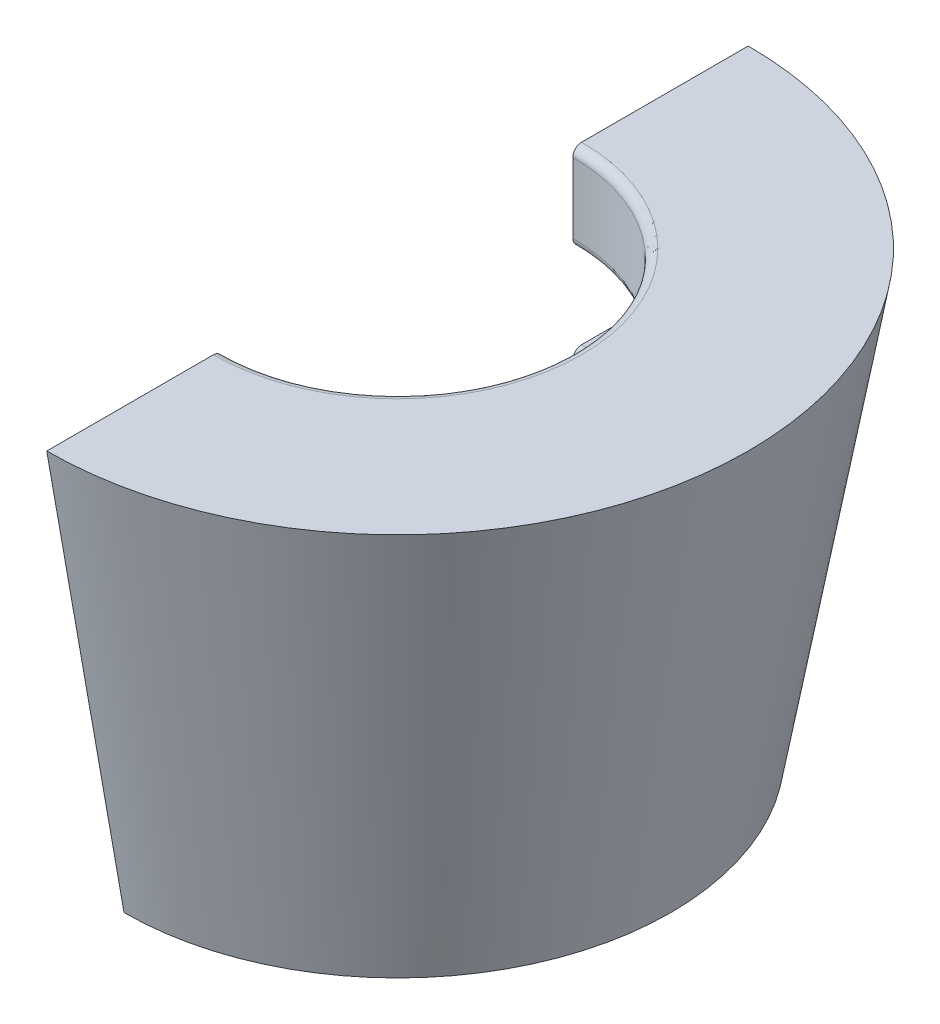
ISO-10303-21;
HEADER;
FILE_DESCRIPTION(('STEP AP214'),'2;1');
FILE_NAME('part.step','',(''),(''),'','','');
FILE_SCHEMA(('AUTOMOTIVE_DESIGN { 1 0 10303 214 1 1 1 1 }'));
ENDSEC;
DATA;
#1=APPLICATION_CONTEXT('core data for automotive mechanical design processes');
#2=APPLICATION_PROTOCOL_DEFINITION('international standard','automotive_design',2000,#1);
#3=PRODUCT_CONTEXT('',#1,'mechanical');
#4=PRODUCT('Part','Part','',(#3));
#5=PRODUCT_RELATED_PRODUCT_CATEGORY('part','',(#4));
#6=PRODUCT_DEFINITION_FORMATION('','',#4);
#7=PRODUCT_DEFINITION_CONTEXT('part definition',#1,'design');
#8=PRODUCT_DEFINITION('design','',#6,#7);
#9=PRODUCT_DEFINITION_SHAPE('','',#8);
#10=(LENGTH_UNIT() NAMED_UNIT(*) SI_UNIT(.MILLI.,.METRE.));
#11=(NAMED_UNIT(*) PLANE_ANGLE_UNIT() SI_UNIT($,.RADIAN.));
#12=(NAMED_UNIT(*) SI_UNIT($,.STERADIAN.) SOLID_ANGLE_UNIT());
#13=UNCERTAINTY_MEASURE_WITH_UNIT(LENGTH_MEASURE(1.E-05),#10,'distance_accuracy_value','');
#14=(GEOMETRIC_REPRESENTATION_CONTEXT(3) GLOBAL_UNCERTAINTY_ASSIGNED_CONTEXT((#13)) GLOBAL_UNIT_ASSIGNED_CONTEXT((#10,
#11,#12)) REPRESENTATION_CONTEXT('',''));
#15=CARTESIAN_POINT('',(0.,0.,0.));
#16=DIRECTION('',(0.,0.,1.));
#17=DIRECTION('',(1.,0.,0.));
#18=AXIS2_PLACEMENT_3D('',#15,#16,#17);
#19=CARTESIAN_POINT('',(0.,0.,0.));
#20=DIRECTION('',(1.,0.,0.));
#21=DIRECTION('',(0.,0.,-1.));
#22=AXIS2_PLACEMENT_3D('',#19,#20,#21);
#23=PLANE('',#22);
#24=DIRECTION('',(0.,1.,0.));
#25=VECTOR('',#24,1.);
#26=CARTESIAN_POINT('',(0.,5.,-2.));
#27=LINE('',#26,#25);
#28=CARTESIAN_POINT('',(0.,4.1,-2.));
#29=VERTEX_POINT('',#28);
#30=CARTESIAN_POINT('',(0.,4.9,-2.));
#31=VERTEX_POINT('',#30);
#32=EDGE_CURVE('E348',#29,#31,#27,.T.);
#33=ORIENTED_EDGE('',*,*,#32,.T.);
#34=CARTESIAN_POINT('',(0.,4.9,-2.1));
#35=DIRECTION('',(1.,0.,0.));
#36=DIRECTION('',(0.,0.,-1.));
#37=AXIS2_PLACEMENT_3D('',#34,#35,#36);
#38=CIRCLE('',#37,0.1);
#39=CARTESIAN_POINT('',(0.,5.,-2.1));
#40=VERTEX_POINT('',#39);
#41=EDGE_CURVE('E238',#31,#40,#38,.F.);
#42=ORIENTED_EDGE('',*,*,#41,.T.);
#43=DIRECTION('',(0.,0.,-1.));
#44=VECTOR('',#43,1.);
#45=CARTESIAN_POINT('',(0.,5.,0.));
#46=LINE('',#45,#44);
#47=CARTESIAN_POINT('',(0.,5.,-4.));
#48=VERTEX_POINT('',#47);
#49=EDGE_CURVE('E196',#40,#48,#46,.T.);
#50=ORIENTED_EDGE('',*,*,#49,.T.);
#51=DIRECTION('',(0.,0.984807753012209,-0.173648177666927));
#52=VECTOR('',#51,1.);
#53=CARTESIAN_POINT('',(0.,-17.6851272784713,0.));
#54=LINE('',#53,#52);
#55=CARTESIAN_POINT('',(0.,0.,-3.11836509645769));
#56=VERTEX_POINT('',#55);
#57=EDGE_CURVE('E185',#56,#48,#54,.T.);
#58=ORIENTED_EDGE('',*,*,#57,.F.);
#59=DIRECTION('',(0.,0.,-1.));
#60=VECTOR('',#59,1.);
#61=CARTESIAN_POINT('',(0.,0.,0.));
#62=LINE('',#61,#60);
#63=CARTESIAN_POINT('',(0.,0.,-2.1));
#64=VERTEX_POINT('',#63);
#65=EDGE_CURVE('E351',#64,#56,#62,.T.);
#66=ORIENTED_EDGE('',*,*,#65,.F.);
#67=CARTESIAN_POINT('',(0.,0.1,-2.1));
#68=DIRECTION('',(1.,0.,0.));
#69=DIRECTION('',(0.,0.,-1.));
#70=AXIS2_PLACEMENT_3D('',#67,#68,#69);
#71=CIRCLE('',#70,0.1);
#72=CARTESIAN_POINT('',(0.,0.1,-2.));
#73=VERTEX_POINT('',#72);
#74=EDGE_CURVE('E235',#64,#73,#71,.F.);
#75=ORIENTED_EDGE('',*,*,#74,.T.);
#76=DIRECTION('',(0.,1.,0.));
#77=VECTOR('',#76,1.);
#78=CARTESIAN_POINT('',(0.,5.,-2.));
#79=LINE('',#78,#77);
#80=CARTESIAN_POINT('',(0.,0.9,-2.));
#81=VERTEX_POINT('',#80);
#82=EDGE_CURVE('E340',#73,#81,#79,.T.);
#83=ORIENTED_EDGE('',*,*,#82,.T.);
#84=CARTESIAN_POINT('',(0.,0.9,-2.1));
#85=DIRECTION('',(1.,0.,0.));
#86=DIRECTION('',(0.,0.,-1.));
#87=AXIS2_PLACEMENT_3D('',#84,#85,#86);
#88=CIRCLE('',#87,0.1);
#89=CARTESIAN_POINT('',(0.,1.,-2.1));
#90=VERTEX_POINT('',#89);
#91=EDGE_CURVE('E232',#81,#90,#88,.F.);
#92=ORIENTED_EDGE('',*,*,#91,.T.);
#93=DIRECTION('',(0.,0.,-1.));
#94=VECTOR('',#93,1.);
#95=CARTESIAN_POINT('',(0.,1.,0.));
#96=LINE('',#95,#94);
#97=CARTESIAN_POINT('',(0.,1.,-3.));
#98=VERTEX_POINT('',#97);
#99=EDGE_CURVE('E337',#90,#98,#96,.T.);
#100=ORIENTED_EDGE('',*,*,#99,.T.);
#101=DIRECTION('',(0.,-1.,0.));
#102=VECTOR('',#101,1.);
#103=CARTESIAN_POINT('',(0.,5.,-3.));
#104=LINE('',#103,#102);
#105=CARTESIAN_POINT('',(0.,2.,-3.));
#106=VERTEX_POINT('',#105);
#107=EDGE_CURVE('E320',#98,#106,#104,.F.);
#108=ORIENTED_EDGE('',*,*,#107,.T.);
#109=DIRECTION('',(0.,0.,1.));
#110=VECTOR('',#109,1.);
#111=CARTESIAN_POINT('',(0.,2.,0.));
#112=LINE('',#111,#110);
#113=CARTESIAN_POINT('',(0.,2.,-2.1));
#114=VERTEX_POINT('',#113);
#115=EDGE_CURVE('E317',#106,#114,#112,.T.);
#116=ORIENTED_EDGE('',*,*,#115,.T.);
#117=CARTESIAN_POINT('',(0.,2.1,-2.1));
#118=DIRECTION('',(1.,0.,0.));
#119=DIRECTION('',(0.,0.,-1.));
#120=AXIS2_PLACEMENT_3D('',#117,#118,#119);
#121=CIRCLE('',#120,0.1);
#122=CARTESIAN_POINT('',(0.,2.1,-2.));
#123=VERTEX_POINT('',#122);
#124=EDGE_CURVE('E229',#114,#123,#121,.F.);
#125=ORIENTED_EDGE('',*,*,#124,.T.);
#126=DIRECTION('',(0.,1.,0.));
#127=VECTOR('',#126,1.);
#128=CARTESIAN_POINT('',(0.,5.,-2.));
#129=LINE('',#128,#127);
#130=CARTESIAN_POINT('',(0.,2.9,-2.));
#131=VERTEX_POINT('',#130);
#132=EDGE_CURVE('E212',#123,#131,#129,.T.);
#133=ORIENTED_EDGE('',*,*,#132,.T.);
#134=CARTESIAN_POINT('',(0.,2.9,-2.1));
#135=DIRECTION('',(1.,0.,0.));
#136=DIRECTION('',(0.,0.,-1.));
#137=AXIS2_PLACEMENT_3D('',#134,#135,#136);
#138=CIRCLE('',#137,0.1);
#139=CARTESIAN_POINT('',(0.,3.,-2.1));
#140=VERTEX_POINT('',#139);
#141=EDGE_CURVE('E226',#131,#140,#138,.F.);
#142=ORIENTED_EDGE('',*,*,#141,.T.);
#143=DIRECTION('',(0.,0.,-1.));
#144=VECTOR('',#143,1.);
#145=CARTESIAN_POINT('',(0.,3.,0.));
#146=LINE('',#145,#144);
#147=CARTESIAN_POINT('',(0.,3.,-3.));
#148=VERTEX_POINT('',#147);
#149=EDGE_CURVE('E293',#140,#148,#146,.T.);
#150=ORIENTED_EDGE('',*,*,#149,.T.);
#151=DIRECTION('',(0.,-1.,0.));
#152=VECTOR('',#151,1.);
#153=CARTESIAN_POINT('',(0.,5.,-3.));
#154=LINE('',#153,#152);
#155=CARTESIAN_POINT('',(0.,4.,-3.));
#156=VERTEX_POINT('',#155);
#157=EDGE_CURVE('E333',#148,#156,#154,.F.);
#158=ORIENTED_EDGE('',*,*,#157,.T.);
#159=DIRECTION('',(0.,0.,1.));
#160=VECTOR('',#159,1.);
#161=CARTESIAN_POINT('',(0.,4.,0.));
#162=LINE('',#161,#160);
#163=CARTESIAN_POINT('',(0.,4.,-2.1));
#164=VERTEX_POINT('',#163);
#165=EDGE_CURVE('E347',#156,#164,#162,.T.);
#166=ORIENTED_EDGE('',*,*,#165,.T.);
#167=CARTESIAN_POINT('',(0.,4.1,-2.1));
#168=DIRECTION('',(1.,0.,0.));
#169=DIRECTION('',(0.,0.,-1.));
#170=AXIS2_PLACEMENT_3D('',#167,#168,#169);
#171=CIRCLE('',#170,0.1);
#172=EDGE_CURVE('E223',#164,#29,#171,.F.);
#173=ORIENTED_EDGE('',*,*,#172,.T.);
#174=EDGE_LOOP('',(#33,#42,#50,#58,#66,#75,#83,#92,#100,#108,#116,#125,#133,#142,#150,#158,#166,#173));
#175=FACE_BOUND('',#174,.T.);
#176=ADVANCED_FACE('F48',(#175),#23,.F.);
#177=CARTESIAN_POINT('',(0.,0.,0.));
#178=DIRECTION('',(0.,1.,0.));
#179=DIRECTION('',(0.,0.,1.));
#180=AXIS2_PLACEMENT_3D('',#177,#178,#179);
#181=PLANE('',#180);
#182=CARTESIAN_POINT('',(0.,0.,3.11836509645769));
#183=VERTEX_POINT('',#182);
#184=CARTESIAN_POINT('',(0.,0.,2.1));
#185=VERTEX_POINT('',#184);
#186=EDGE_CURVE('E179',#183,#185,#62,.T.);
#187=ORIENTED_EDGE('',*,*,#186,.T.);
#188=CARTESIAN_POINT('',(0.,0.,0.));
#189=DIRECTION('',(0.,1.,0.));
#190=DIRECTION('',(0.,0.,1.));
#191=AXIS2_PLACEMENT_3D('',#188,#189,#190);
#192=CIRCLE('',#191,2.1);
#193=EDGE_CURVE('E259',#185,#64,#192,.T.);
#194=ORIENTED_EDGE('',*,*,#193,.T.);
#195=ORIENTED_EDGE('',*,*,#65,.T.);
#196=CARTESIAN_POINT('',(0.,0.,0.));
#197=DIRECTION('',(0.,-1.,0.));
#198=DIRECTION('',(0.,0.,-1.));
#199=AXIS2_PLACEMENT_3D('',#196,#197,#198);
#200=CIRCLE('',#199,3.11836509645769);
#201=EDGE_CURVE('E209',#56,#183,#200,.T.);
#202=ORIENTED_EDGE('',*,*,#201,.T.);
#203=EDGE_LOOP('',(#187,#194,#195,#202));
#204=FACE_BOUND('',#203,.T.);
#205=ADVANCED_FACE('F404',(#204),#181,.F.);
#206=CARTESIAN_POINT('',(0.,5.,0.));
#207=DIRECTION('',(0.,1.,0.));
#208=DIRECTION('',(0.,0.,1.));
#209=AXIS2_PLACEMENT_3D('',#206,#207,#208);
#210=PLANE('',#209);
#211=ORIENTED_EDGE('',*,*,#49,.F.);
#212=CARTESIAN_POINT('',(0.,5.,0.));
#213=DIRECTION('',(0.,1.,0.));
#214=DIRECTION('',(0.,0.,1.));
#215=AXIS2_PLACEMENT_3D('',#212,#213,#214);
#216=CIRCLE('',#215,2.1);
#217=CARTESIAN_POINT('',(0.,5.,2.1));
#218=VERTEX_POINT('',#217);
#219=EDGE_CURVE('E193',#40,#218,#216,.F.);
#220=ORIENTED_EDGE('',*,*,#219,.T.);
#221=CARTESIAN_POINT('',(0.,5.,4.));
#222=VERTEX_POINT('',#221);
#223=EDGE_CURVE('E177',#222,#218,#46,.T.);
#224=ORIENTED_EDGE('',*,*,#223,.F.);
#225=CARTESIAN_POINT('',(0.,5.,0.));
#226=DIRECTION('',(0.,-1.,0.));
#227=DIRECTION('',(0.,0.,-1.));
#228=AXIS2_PLACEMENT_3D('',#225,#226,#227);
#229=CIRCLE('',#228,4.);
#230=EDGE_CURVE('E186',#48,#222,#229,.T.);
#231=ORIENTED_EDGE('',*,*,#230,.F.);
#232=EDGE_LOOP('',(#211,#220,#224,#231));
#233=FACE_BOUND('',#232,.T.);
#234=ADVANCED_FACE('F191',(#233),#210,.T.);
#235=CARTESIAN_POINT('',(-3.,1.,0.));
#236=DIRECTION('',(0.,1.,0.));
#237=DIRECTION('',(0.,0.,1.));
#238=AXIS2_PLACEMENT_3D('',#235,#236,#237);
#239=PLANE('',#238);
#240=ORIENTED_EDGE('',*,*,#99,.F.);
#241=CARTESIAN_POINT('',(0.,1.,0.));
#242=DIRECTION('',(0.,1.,0.));
#243=DIRECTION('',(0.,0.,1.));
#244=AXIS2_PLACEMENT_3D('',#241,#242,#243);
#245=CIRCLE('',#244,2.1);
#246=CARTESIAN_POINT('',(0.,1.,2.1));
#247=VERTEX_POINT('',#246);
#248=EDGE_CURVE('E270',#90,#247,#245,.F.);
#249=ORIENTED_EDGE('',*,*,#248,.T.);
#250=CARTESIAN_POINT('',(0.,1.,3.));
#251=VERTEX_POINT('',#250);
#252=EDGE_CURVE('E342',#251,#247,#96,.T.);
#253=ORIENTED_EDGE('',*,*,#252,.F.);
#254=CARTESIAN_POINT('',(0.,1.,0.));
#255=DIRECTION('',(0.,1.,0.));
#256=DIRECTION('',(0.,0.,1.));
#257=AXIS2_PLACEMENT_3D('',#254,#255,#256);
#258=CIRCLE('',#257,3.);
#259=EDGE_CURVE('E211',#251,#98,#258,.T.);
#260=ORIENTED_EDGE('',*,*,#259,.T.);
#261=EDGE_LOOP('',(#240,#249,#253,#260));
#262=FACE_BOUND('',#261,.T.);
#263=ADVANCED_FACE('F400',(#262),#239,.T.);
#264=CARTESIAN_POINT('',(0.,5.,0.));
#265=DIRECTION('',(0.,1.,0.));
#266=DIRECTION('',(0.,0.,1.));
#267=AXIS2_PLACEMENT_3D('',#264,#265,#266);
#268=CYLINDRICAL_SURFACE('',#267,2.);
#269=ORIENTED_EDGE('',*,*,#82,.F.);
#270=CARTESIAN_POINT('',(0.,0.1,0.));
#271=DIRECTION('',(0.,1.,0.));
#272=DIRECTION('',(0.,0.,1.));
#273=AXIS2_PLACEMENT_3D('',#270,#271,#272);
#274=CIRCLE('',#273,2.);
#275=CARTESIAN_POINT('',(0.,0.1,2.));
#276=VERTEX_POINT('',#275);
#277=EDGE_CURVE('E267',#73,#276,#274,.F.);
#278=ORIENTED_EDGE('',*,*,#277,.T.);
#279=DIRECTION('',(0.,1.,0.));
#280=VECTOR('',#279,1.);
#281=CARTESIAN_POINT('',(0.,5.,2.));
#282=LINE('',#281,#280);
#283=CARTESIAN_POINT('',(0.,0.9,2.));
#284=VERTEX_POINT('',#283);
#285=EDGE_CURVE('E363',#284,#276,#282,.F.);
#286=ORIENTED_EDGE('',*,*,#285,.F.);
#287=CARTESIAN_POINT('',(0.,0.9,0.));
#288=DIRECTION('',(0.,1.,0.));
#289=DIRECTION('',(0.,0.,1.));
#290=AXIS2_PLACEMENT_3D('',#287,#288,#289);
#291=CIRCLE('',#290,2.);
#292=EDGE_CURVE('E263',#284,#81,#291,.T.);
#293=ORIENTED_EDGE('',*,*,#292,.T.);
#294=EDGE_LOOP('',(#269,#278,#286,#293));
#295=FACE_BOUND('',#294,.T.);
#296=ADVANCED_FACE('F392',(#295),#268,.F.);
#297=CARTESIAN_POINT('',(-3.,4.,0.));
#298=DIRECTION('',(0.,-1.,0.));
#299=DIRECTION('',(0.,0.,-1.));
#300=AXIS2_PLACEMENT_3D('',#297,#298,#299);
#301=PLANE('',#300);
#302=CARTESIAN_POINT('',(0.,4.,2.1));
#303=VERTEX_POINT('',#302);
#304=CARTESIAN_POINT('',(0.,4.,3.));
#305=VERTEX_POINT('',#304);
#306=EDGE_CURVE('E366',#303,#305,#162,.T.);
#307=ORIENTED_EDGE('',*,*,#306,.F.);
#308=CARTESIAN_POINT('',(0.,4.,0.));
#309=DIRECTION('',(0.,-1.,0.));
#310=DIRECTION('',(0.,0.,-1.));
#311=AXIS2_PLACEMENT_3D('',#308,#309,#310);
#312=CIRCLE('',#311,2.1);
#313=EDGE_CURVE('E12',#303,#164,#312,.F.);
#314=ORIENTED_EDGE('',*,*,#313,.T.);
#315=ORIENTED_EDGE('',*,*,#165,.F.);
#316=CARTESIAN_POINT('',(0.,4.,0.));
#317=DIRECTION('',(0.,-1.,0.));
#318=DIRECTION('',(0.,0.,-1.));
#319=AXIS2_PLACEMENT_3D('',#316,#317,#318);
#320=CIRCLE('',#319,3.);
#321=EDGE_CURVE('E322',#156,#305,#320,.T.);
#322=ORIENTED_EDGE('',*,*,#321,.T.);
#323=EDGE_LOOP('',(#307,#314,#315,#322));
#324=FACE_BOUND('',#323,.T.);
#325=ADVANCED_FACE('F389',(#324),#301,.T.);
#326=CARTESIAN_POINT('',(0.,5.,0.));
#327=DIRECTION('',(0.,1.,0.));
#328=DIRECTION('',(0.,0.,1.));
#329=AXIS2_PLACEMENT_3D('',#326,#327,#328);
#330=CYLINDRICAL_SURFACE('',#329,2.);
#331=DIRECTION('',(0.,1.,0.));
#332=VECTOR('',#331,1.);
#333=CARTESIAN_POINT('',(0.,5.,2.));
#334=LINE('',#333,#332);
#335=CARTESIAN_POINT('',(0.,4.9,2.));
#336=VERTEX_POINT('',#335);
#337=CARTESIAN_POINT('',(0.,4.1,2.));
#338=VERTEX_POINT('',#337);
#339=EDGE_CURVE('E369',#336,#338,#334,.F.);
#340=ORIENTED_EDGE('',*,*,#339,.F.);
#341=CARTESIAN_POINT('',(0.,4.9,0.));
#342=DIRECTION('',(0.,1.,0.));
#343=DIRECTION('',(0.,0.,1.));
#344=AXIS2_PLACEMENT_3D('',#341,#342,#343);
#345=CIRCLE('',#344,2.);
#346=EDGE_CURVE('E219',#336,#31,#345,.T.);
#347=ORIENTED_EDGE('',*,*,#346,.T.);
#348=ORIENTED_EDGE('',*,*,#32,.F.);
#349=CARTESIAN_POINT('',(0.,4.1,0.));
#350=DIRECTION('',(0.,-1.,0.));
#351=DIRECTION('',(0.,0.,-1.));
#352=AXIS2_PLACEMENT_3D('',#349,#350,#351);
#353=CIRCLE('',#352,2.);
#354=EDGE_CURVE('E216',#29,#338,#353,.T.);
#355=ORIENTED_EDGE('',*,*,#354,.T.);
#356=EDGE_LOOP('',(#340,#347,#348,#355));
#357=FACE_BOUND('',#356,.T.);
#358=ADVANCED_FACE('F383',(#357),#330,.F.);
#359=CARTESIAN_POINT('',(0.,5.,0.));
#360=DIRECTION('',(0.,-1.,0.));
#361=DIRECTION('',(0.,0.,-1.));
#362=AXIS2_PLACEMENT_3D('',#359,#360,#361);
#363=CYLINDRICAL_SURFACE('',#362,3.);
#364=DIRECTION('',(0.,-1.,0.));
#365=VECTOR('',#364,1.);
#366=CARTESIAN_POINT('',(0.,5.,3.));
#367=LINE('',#366,#365);
#368=CARTESIAN_POINT('',(0.,2.,3.));
#369=VERTEX_POINT('',#368);
#370=EDGE_CURVE('E356',#369,#251,#367,.T.);
#371=ORIENTED_EDGE('',*,*,#370,.F.);
#372=CARTESIAN_POINT('',(0.,2.,0.));
#373=DIRECTION('',(0.,-1.,0.));
#374=DIRECTION('',(0.,0.,-1.));
#375=AXIS2_PLACEMENT_3D('',#372,#373,#374);
#376=CIRCLE('',#375,3.);
#377=EDGE_CURVE('E201',#106,#369,#376,.T.);
#378=ORIENTED_EDGE('',*,*,#377,.F.);
#379=ORIENTED_EDGE('',*,*,#107,.F.);
#380=ORIENTED_EDGE('',*,*,#259,.F.);
#381=EDGE_LOOP('',(#371,#378,#379,#380));
#382=FACE_BOUND('',#381,.T.);
#383=ADVANCED_FACE('F398',(#382),#363,.F.);
#384=DIRECTION('',(0.,-1.,0.));
#385=VECTOR('',#384,1.);
#386=CARTESIAN_POINT('',(0.,5.,3.));
#387=LINE('',#386,#385);
#388=CARTESIAN_POINT('',(0.,3.,3.));
#389=VERTEX_POINT('',#388);
#390=EDGE_CURVE('E299',#305,#389,#387,.T.);
#391=ORIENTED_EDGE('',*,*,#390,.F.);
#392=ORIENTED_EDGE('',*,*,#321,.F.);
#393=ORIENTED_EDGE('',*,*,#157,.F.);
#394=CARTESIAN_POINT('',(0.,3.,0.));
#395=DIRECTION('',(0.,1.,0.));
#396=DIRECTION('',(0.,0.,1.));
#397=AXIS2_PLACEMENT_3D('',#394,#395,#396);
#398=CIRCLE('',#397,3.);
#399=EDGE_CURVE('E205',#389,#148,#398,.T.);
#400=ORIENTED_EDGE('',*,*,#399,.F.);
#401=EDGE_LOOP('',(#391,#392,#393,#400));
#402=FACE_BOUND('',#401,.T.);
#403=ADVANCED_FACE('F331',(#402),#363,.F.);
#404=CARTESIAN_POINT('',(0.,5.,0.));
#405=DIRECTION('',(0.,1.,0.));
#406=DIRECTION('',(0.,0.,1.));
#407=AXIS2_PLACEMENT_3D('',#404,#405,#406);
#408=CYLINDRICAL_SURFACE('',#407,2.);
#409=ORIENTED_EDGE('',*,*,#132,.F.);
#410=CARTESIAN_POINT('',(0.,2.1,0.));
#411=DIRECTION('',(0.,-1.,0.));
#412=DIRECTION('',(0.,0.,-1.));
#413=AXIS2_PLACEMENT_3D('',#410,#411,#412);
#414=CIRCLE('',#413,2.);
#415=CARTESIAN_POINT('',(0.,2.1,2.));
#416=VERTEX_POINT('',#415);
#417=EDGE_CURVE('E281',#123,#416,#414,.T.);
#418=ORIENTED_EDGE('',*,*,#417,.T.);
#419=DIRECTION('',(0.,1.,0.));
#420=VECTOR('',#419,1.);
#421=CARTESIAN_POINT('',(0.,5.,2.));
#422=LINE('',#421,#420);
#423=CARTESIAN_POINT('',(0.,2.9,2.));
#424=VERTEX_POINT('',#423);
#425=EDGE_CURVE('E301',#424,#416,#422,.F.);
#426=ORIENTED_EDGE('',*,*,#425,.F.);
#427=CARTESIAN_POINT('',(0.,2.9,0.));
#428=DIRECTION('',(0.,1.,0.));
#429=DIRECTION('',(0.,0.,1.));
#430=AXIS2_PLACEMENT_3D('',#427,#428,#429);
#431=CIRCLE('',#430,2.);
#432=EDGE_CURVE('E277',#424,#131,#431,.T.);
#433=ORIENTED_EDGE('',*,*,#432,.T.);
#434=EDGE_LOOP('',(#409,#418,#426,#433));
#435=FACE_BOUND('',#434,.T.);
#436=ADVANCED_FACE('F309',(#435),#408,.F.);
#437=CARTESIAN_POINT('',(-3.,3.,0.));
#438=DIRECTION('',(0.,1.,0.));
#439=DIRECTION('',(0.,0.,1.));
#440=AXIS2_PLACEMENT_3D('',#437,#438,#439);
#441=PLANE('',#440);
#442=ORIENTED_EDGE('',*,*,#149,.F.);
#443=CARTESIAN_POINT('',(0.,3.,0.));
#444=DIRECTION('',(0.,1.,0.));
#445=DIRECTION('',(0.,0.,1.));
#446=AXIS2_PLACEMENT_3D('',#443,#444,#445);
#447=CIRCLE('',#446,2.1);
#448=CARTESIAN_POINT('',(0.,3.,2.1));
#449=VERTEX_POINT('',#448);
#450=EDGE_CURVE('E57',#140,#449,#447,.F.);
#451=ORIENTED_EDGE('',*,*,#450,.T.);
#452=EDGE_CURVE('E291',#389,#449,#146,.T.);
#453=ORIENTED_EDGE('',*,*,#452,.F.);
#454=ORIENTED_EDGE('',*,*,#399,.T.);
#455=EDGE_LOOP('',(#442,#451,#453,#454));
#456=FACE_BOUND('',#455,.T.);
#457=ADVANCED_FACE('F289',(#456),#441,.T.);
#458=CARTESIAN_POINT('',(-3.,2.,0.));
#459=DIRECTION('',(0.,-1.,0.));
#460=DIRECTION('',(0.,0.,-1.));
#461=AXIS2_PLACEMENT_3D('',#458,#459,#460);
#462=PLANE('',#461);
#463=CARTESIAN_POINT('',(0.,2.,2.1));
#464=VERTEX_POINT('',#463);
#465=EDGE_CURVE('E302',#464,#369,#112,.T.);
#466=ORIENTED_EDGE('',*,*,#465,.F.);
#467=CARTESIAN_POINT('',(0.,2.,0.));
#468=DIRECTION('',(0.,-1.,0.));
#469=DIRECTION('',(0.,0.,-1.));
#470=AXIS2_PLACEMENT_3D('',#467,#468,#469);
#471=CIRCLE('',#470,2.1);
#472=EDGE_CURVE('E273',#464,#114,#471,.F.);
#473=ORIENTED_EDGE('',*,*,#472,.T.);
#474=ORIENTED_EDGE('',*,*,#115,.F.);
#475=ORIENTED_EDGE('',*,*,#377,.T.);
#476=EDGE_LOOP('',(#466,#473,#474,#475));
#477=FACE_BOUND('',#476,.T.);
#478=ADVANCED_FACE('F419',(#477),#462,.T.);
#479=CARTESIAN_POINT('',(0.,5.,0.));
#480=DIRECTION('',(0.,1.,0.));
#481=DIRECTION('',(0.,0.,1.));
#482=AXIS2_PLACEMENT_3D('',#479,#480,#481);
#483=CONICAL_SURFACE('',#482,4.,0.17453292519943);
#484=ORIENTED_EDGE('',*,*,#201,.F.);
#485=ORIENTED_EDGE('',*,*,#57,.T.);
#486=ORIENTED_EDGE('',*,*,#230,.T.);
#487=DIRECTION('',(0.,-0.984807753012209,-0.173648177666927));
#488=VECTOR('',#487,1.);
#489=CARTESIAN_POINT('',(0.,-17.6851272784713,0.));
#490=LINE('',#489,#488);
#491=EDGE_CURVE('E174',#222,#183,#490,.T.);
#492=ORIENTED_EDGE('',*,*,#491,.T.);
#493=EDGE_LOOP('',(#484,#485,#486,#492));
#494=FACE_BOUND('',#493,.T.);
#495=ADVANCED_FACE('F198',(#494),#483,.T.);
#496=ORIENTED_EDGE('',*,*,#223,.T.);
#497=CARTESIAN_POINT('',(0.,4.9,2.1));
#498=DIRECTION('',(1.,0.,0.));
#499=DIRECTION('',(0.,0.,-1.));
#500=AXIS2_PLACEMENT_3D('',#497,#498,#499);
#501=CIRCLE('',#500,0.1);
#502=EDGE_CURVE('E256',#218,#336,#501,.F.);
#503=ORIENTED_EDGE('',*,*,#502,.T.);
#504=ORIENTED_EDGE('',*,*,#339,.T.);
#505=CARTESIAN_POINT('',(0.,4.1,2.1));
#506=DIRECTION('',(1.,0.,0.));
#507=DIRECTION('',(0.,0.,-1.));
#508=AXIS2_PLACEMENT_3D('',#505,#506,#507);
#509=CIRCLE('',#508,0.1);
#510=EDGE_CURVE('E64',#338,#303,#509,.F.);
#511=ORIENTED_EDGE('',*,*,#510,.T.);
#512=ORIENTED_EDGE('',*,*,#306,.T.);
#513=ORIENTED_EDGE('',*,*,#390,.T.);
#514=ORIENTED_EDGE('',*,*,#452,.T.);
#515=CARTESIAN_POINT('',(0.,2.9,2.1));
#516=DIRECTION('',(1.,0.,0.));
#517=DIRECTION('',(0.,0.,-1.));
#518=AXIS2_PLACEMENT_3D('',#515,#516,#517);
#519=CIRCLE('',#518,0.1);
#520=EDGE_CURVE('E245',#449,#424,#519,.F.);
#521=ORIENTED_EDGE('',*,*,#520,.T.);
#522=ORIENTED_EDGE('',*,*,#425,.T.);
#523=CARTESIAN_POINT('',(0.,2.1,2.1));
#524=DIRECTION('',(1.,0.,0.));
#525=DIRECTION('',(0.,0.,-1.));
#526=AXIS2_PLACEMENT_3D('',#523,#524,#525);
#527=CIRCLE('',#526,0.1);
#528=EDGE_CURVE('E248',#416,#464,#527,.F.);
#529=ORIENTED_EDGE('',*,*,#528,.T.);
#530=ORIENTED_EDGE('',*,*,#465,.T.);
#531=ORIENTED_EDGE('',*,*,#370,.T.);
#532=ORIENTED_EDGE('',*,*,#252,.T.);
#533=CARTESIAN_POINT('',(0.,0.9,2.1));
#534=DIRECTION('',(1.,0.,0.));
#535=DIRECTION('',(0.,0.,-1.));
#536=AXIS2_PLACEMENT_3D('',#533,#534,#535);
#537=CIRCLE('',#536,0.1);
#538=EDGE_CURVE('E251',#247,#284,#537,.F.);
#539=ORIENTED_EDGE('',*,*,#538,.T.);
#540=ORIENTED_EDGE('',*,*,#285,.T.);
#541=CARTESIAN_POINT('',(0.,0.1,2.1));
#542=DIRECTION('',(1.,0.,0.));
#543=DIRECTION('',(0.,0.,-1.));
#544=AXIS2_PLACEMENT_3D('',#541,#542,#543);
#545=CIRCLE('',#544,0.1);
#546=EDGE_CURVE('E71',#276,#185,#545,.F.);
#547=ORIENTED_EDGE('',*,*,#546,.T.);
#548=ORIENTED_EDGE('',*,*,#186,.F.);
#549=ORIENTED_EDGE('',*,*,#491,.F.);
#550=EDGE_LOOP('',(#496,#503,#504,#511,#512,#513,#514,#521,#522,#529,#530,#531,#532,#539,#540,
#547,#548,#549));
#551=FACE_BOUND('',#550,.T.);
#552=ADVANCED_FACE('F176',(#551),#23,.F.);
#553=CARTESIAN_POINT('',(0.,4.9,0.));
#554=DIRECTION('',(0.,1.,0.));
#555=DIRECTION('',(0.,0.,1.));
#556=AXIS2_PLACEMENT_3D('',#553,#554,#555);
#557=TOROIDAL_SURFACE('',#556,2.1,0.1);
#558=ORIENTED_EDGE('',*,*,#502,.F.);
#559=ORIENTED_EDGE('',*,*,#219,.F.);
#560=ORIENTED_EDGE('',*,*,#41,.F.);
#561=ORIENTED_EDGE('',*,*,#346,.F.);
#562=EDGE_LOOP('',(#558,#559,#560,#561));
#563=FACE_BOUND('',#562,.T.);
#564=ADVANCED_FACE('F379',(#563),#557,.T.);
#565=CARTESIAN_POINT('',(0.,0.1,0.));
#566=DIRECTION('',(0.,1.,0.));
#567=DIRECTION('',(0.,0.,1.));
#568=AXIS2_PLACEMENT_3D('',#565,#566,#567);
#569=TOROIDAL_SURFACE('',#568,2.1,0.1);
#570=ORIENTED_EDGE('',*,*,#546,.F.);
#571=ORIENTED_EDGE('',*,*,#277,.F.);
#572=ORIENTED_EDGE('',*,*,#74,.F.);
#573=ORIENTED_EDGE('',*,*,#193,.F.);
#574=EDGE_LOOP('',(#570,#571,#572,#573));
#575=FACE_BOUND('',#574,.T.);
#576=ADVANCED_FACE('F417',(#575),#569,.T.);
#577=CARTESIAN_POINT('',(0.,0.9,0.));
#578=DIRECTION('',(0.,1.,0.));
#579=DIRECTION('',(0.,0.,1.));
#580=AXIS2_PLACEMENT_3D('',#577,#578,#579);
#581=TOROIDAL_SURFACE('',#580,2.1,0.1);
#582=ORIENTED_EDGE('',*,*,#538,.F.);
#583=ORIENTED_EDGE('',*,*,#248,.F.);
#584=ORIENTED_EDGE('',*,*,#91,.F.);
#585=ORIENTED_EDGE('',*,*,#292,.F.);
#586=EDGE_LOOP('',(#582,#583,#584,#585));
#587=FACE_BOUND('',#586,.T.);
#588=ADVANCED_FACE('F429',(#587),#581,.T.);
#589=CARTESIAN_POINT('',(0.,2.1,0.));
#590=DIRECTION('',(0.,-1.,0.));
#591=DIRECTION('',(0.,0.,-1.));
#592=AXIS2_PLACEMENT_3D('',#589,#590,#591);
#593=TOROIDAL_SURFACE('',#592,2.1,0.1);
#594=ORIENTED_EDGE('',*,*,#528,.F.);
#595=ORIENTED_EDGE('',*,*,#417,.F.);
#596=ORIENTED_EDGE('',*,*,#124,.F.);
#597=ORIENTED_EDGE('',*,*,#472,.F.);
#598=EDGE_LOOP('',(#594,#595,#596,#597));
#599=FACE_BOUND('',#598,.T.);
#600=ADVANCED_FACE('F433',(#599),#593,.T.);
#601=CARTESIAN_POINT('',(0.,2.9,0.));
#602=DIRECTION('',(0.,1.,0.));
#603=DIRECTION('',(0.,0.,1.));
#604=AXIS2_PLACEMENT_3D('',#601,#602,#603);
#605=TOROIDAL_SURFACE('',#604,2.1,0.1);
#606=ORIENTED_EDGE('',*,*,#520,.F.);
#607=ORIENTED_EDGE('',*,*,#450,.F.);
#608=ORIENTED_EDGE('',*,*,#141,.F.);
#609=ORIENTED_EDGE('',*,*,#432,.F.);
#610=EDGE_LOOP('',(#606,#607,#608,#609));
#611=FACE_BOUND('',#610,.T.);
#612=ADVANCED_FACE('F305',(#611),#605,.T.);
#613=CARTESIAN_POINT('',(0.,4.1,0.));
#614=DIRECTION('',(0.,-1.,0.));
#615=DIRECTION('',(0.,0.,-1.));
#616=AXIS2_PLACEMENT_3D('',#613,#614,#615);
#617=TOROIDAL_SURFACE('',#616,2.1,0.1);
#618=ORIENTED_EDGE('',*,*,#510,.F.);
#619=ORIENTED_EDGE('',*,*,#354,.F.);
#620=ORIENTED_EDGE('',*,*,#172,.F.);
#621=ORIENTED_EDGE('',*,*,#313,.F.);
#622=EDGE_LOOP('',(#618,#619,#620,#621));
#623=FACE_BOUND('',#622,.T.);
#624=ADVANCED_FACE('F50',(#623),#617,.T.);
#625=CLOSED_SHELL('',(#176,#205,#234,#263,#296,#325,#358,#383,#403,#436,#457,#478,#495,#552,
#564,#576,#588,#600,#612,#624));
#626=MANIFOLD_SOLID_BREP('B2',#625);
#627=ADVANCED_BREP_SHAPE_REPRESENTATION('',(#18,#626),#14);
#628=SHAPE_DEFINITION_REPRESENTATION(#9,#627);
ENDSEC;
END-ISO-10303-21;
